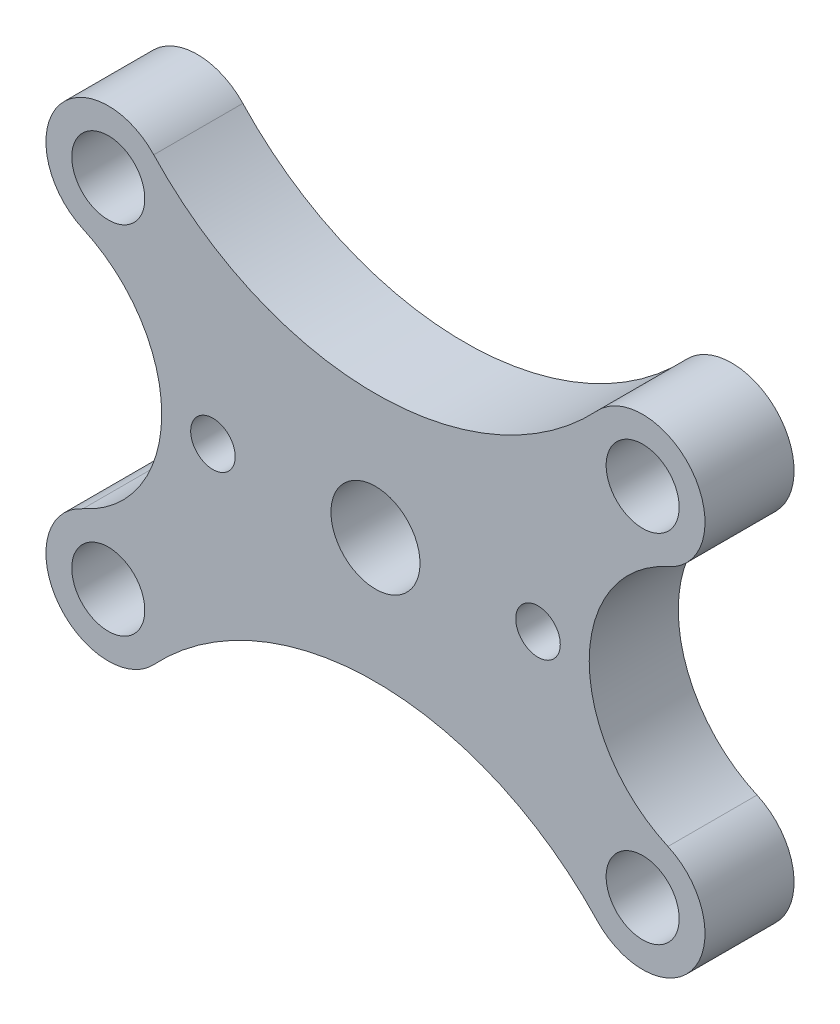
ISO-10303-21;
HEADER;
FILE_DESCRIPTION(('STEP AP214'),'2;1');
FILE_NAME('part.step','',(''),(''),'','','');
FILE_SCHEMA(('AUTOMOTIVE_DESIGN { 1 0 10303 214 1 1 1 1 }'));
ENDSEC;
DATA;
#1=APPLICATION_CONTEXT('core data for automotive mechanical design processes');
#2=APPLICATION_PROTOCOL_DEFINITION('international standard','automotive_design',2000,#1);
#3=PRODUCT_CONTEXT('',#1,'mechanical');
#4=PRODUCT('Part','Part','',(#3));
#5=PRODUCT_RELATED_PRODUCT_CATEGORY('part','',(#4));
#6=PRODUCT_DEFINITION_FORMATION('','',#4);
#7=PRODUCT_DEFINITION_CONTEXT('part definition',#1,'design');
#8=PRODUCT_DEFINITION('design','',#6,#7);
#9=PRODUCT_DEFINITION_SHAPE('','',#8);
#10=(LENGTH_UNIT() NAMED_UNIT(*) SI_UNIT(.MILLI.,.METRE.));
#11=(NAMED_UNIT(*) PLANE_ANGLE_UNIT() SI_UNIT($,.RADIAN.));
#12=(NAMED_UNIT(*) SI_UNIT($,.STERADIAN.) SOLID_ANGLE_UNIT());
#13=UNCERTAINTY_MEASURE_WITH_UNIT(LENGTH_MEASURE(1.E-05),#10,'distance_accuracy_value','');
#14=(GEOMETRIC_REPRESENTATION_CONTEXT(3) GLOBAL_UNCERTAINTY_ASSIGNED_CONTEXT((#13)) GLOBAL_UNIT_ASSIGNED_CONTEXT((#10,
#11,#12)) REPRESENTATION_CONTEXT('',''));
#15=CARTESIAN_POINT('',(0.,0.,0.));
#16=DIRECTION('',(0.,0.,1.));
#17=DIRECTION('',(1.,0.,0.));
#18=AXIS2_PLACEMENT_3D('',#15,#16,#17);
#19=CARTESIAN_POINT('',(0.,48.1153846153846,10.));
#20=DIRECTION('',(0.,0.,-1.));
#21=DIRECTION('',(-1.,0.,0.));
#22=AXIS2_PLACEMENT_3D('',#19,#20,#21);
#23=CYLINDRICAL_SURFACE('',#22,34.1153846153846);
#24=CARTESIAN_POINT('',(0.,48.1153846153846,0.));
#25=DIRECTION('',(0.,0.,-1.));
#26=DIRECTION('',(1.,0.,0.));
#27=AXIS2_PLACEMENT_3D('',#24,#25,#26);
#28=CIRCLE('',#27,34.1153846153846);
#29=CARTESIAN_POINT('',(24.8924228250702,24.7867165575304,0.));
#30=VERTEX_POINT('',#29);
#31=CARTESIAN_POINT('',(-24.8924228250702,24.7867165575304,0.));
#32=VERTEX_POINT('',#31);
#33=EDGE_CURVE('E86',#30,#32,#28,.T.);
#34=ORIENTED_EDGE('',*,*,#33,.T.);
#35=DIRECTION('',(0.,0.,-1.));
#36=VECTOR('',#35,1.);
#37=CARTESIAN_POINT('',(-24.8924228250702,24.7867165575304,10.));
#38=LINE('',#37,#36);
#39=CARTESIAN_POINT('',(-24.8924228250702,24.7867165575304,10.));
#40=VERTEX_POINT('',#39);
#41=EDGE_CURVE('E153',#40,#32,#38,.T.);
#42=ORIENTED_EDGE('',*,*,#41,.F.);
#43=CARTESIAN_POINT('',(0.,48.1153846153846,10.));
#44=DIRECTION('',(0.,0.,-1.));
#45=DIRECTION('',(1.,0.,0.));
#46=AXIS2_PLACEMENT_3D('',#43,#44,#45);
#47=CIRCLE('',#46,34.1153846153846);
#48=CARTESIAN_POINT('',(24.8924228250702,24.7867165575304,10.));
#49=VERTEX_POINT('',#48);
#50=EDGE_CURVE('E114',#49,#40,#47,.T.);
#51=ORIENTED_EDGE('',*,*,#50,.F.);
#52=DIRECTION('',(0.,0.,-1.));
#53=VECTOR('',#52,1.);
#54=CARTESIAN_POINT('',(24.8924228250702,24.7867165575304,10.));
#55=LINE('',#54,#53);
#56=EDGE_CURVE('E42',#49,#30,#55,.T.);
#57=ORIENTED_EDGE('',*,*,#56,.T.);
#58=EDGE_LOOP('',(#34,#42,#51,#57));
#59=FACE_BOUND('',#58,.T.);
#60=ADVANCED_FACE('F34',(#59),#23,.F.);
#61=CARTESIAN_POINT('',(38.8846153846154,0.,10.));
#62=DIRECTION('',(0.,0.,-1.));
#63=DIRECTION('',(-1.,0.,0.));
#64=AXIS2_PLACEMENT_3D('',#61,#62,#63);
#65=CYLINDRICAL_SURFACE('',#64,14.8846153846154);
#66=CARTESIAN_POINT('',(38.8846153846154,0.,0.));
#67=DIRECTION('',(0.,0.,-1.));
#68=DIRECTION('',(-1.,0.,0.));
#69=AXIS2_PLACEMENT_3D('',#66,#67,#68);
#70=CIRCLE('',#69,14.8846153846154);
#71=CARTESIAN_POINT('',(32.8418277680141,-13.6028119507909,0.));
#72=VERTEX_POINT('',#71);
#73=CARTESIAN_POINT('',(32.8418277680141,13.6028119507909,0.));
#74=VERTEX_POINT('',#73);
#75=EDGE_CURVE('E61',#72,#74,#70,.T.);
#76=ORIENTED_EDGE('',*,*,#75,.T.);
#77=DIRECTION('',(0.,0.,-1.));
#78=VECTOR('',#77,1.);
#79=CARTESIAN_POINT('',(32.8418277680141,13.6028119507909,10.));
#80=LINE('',#79,#78);
#81=CARTESIAN_POINT('',(32.8418277680141,13.6028119507909,10.));
#82=VERTEX_POINT('',#81);
#83=EDGE_CURVE('E11',#82,#74,#80,.T.);
#84=ORIENTED_EDGE('',*,*,#83,.F.);
#85=CARTESIAN_POINT('',(38.8846153846154,0.,10.));
#86=DIRECTION('',(0.,0.,-1.));
#87=DIRECTION('',(-1.,0.,0.));
#88=AXIS2_PLACEMENT_3D('',#85,#86,#87);
#89=CIRCLE('',#88,14.8846153846154);
#90=CARTESIAN_POINT('',(32.8418277680141,-13.6028119507909,10.));
#91=VERTEX_POINT('',#90);
#92=EDGE_CURVE('E66',#91,#82,#89,.T.);
#93=ORIENTED_EDGE('',*,*,#92,.F.);
#94=DIRECTION('',(0.,0.,-1.));
#95=VECTOR('',#94,1.);
#96=CARTESIAN_POINT('',(32.8418277680141,-13.6028119507909,10.));
#97=LINE('',#96,#95);
#98=EDGE_CURVE('E88',#91,#72,#97,.T.);
#99=ORIENTED_EDGE('',*,*,#98,.T.);
#100=EDGE_LOOP('',(#76,#84,#93,#99));
#101=FACE_BOUND('',#100,.T.);
#102=ADVANCED_FACE('F89',(#101),#65,.F.);
#103=CARTESIAN_POINT('',(30.,20.,10.));
#104=DIRECTION('',(0.,0.,-1.));
#105=DIRECTION('',(-1.,0.,0.));
#106=AXIS2_PLACEMENT_3D('',#103,#104,#105);
#107=CYLINDRICAL_SURFACE('',#106,7.);
#108=CARTESIAN_POINT('',(30.,20.,0.));
#109=DIRECTION('',(0.,0.,1.));
#110=DIRECTION('',(-1.,0.,0.));
#111=AXIS2_PLACEMENT_3D('',#108,#109,#110);
#112=CIRCLE('',#111,7.);
#113=EDGE_CURVE('E85',#74,#30,#112,.T.);
#114=ORIENTED_EDGE('',*,*,#113,.T.);
#115=ORIENTED_EDGE('',*,*,#56,.F.);
#116=CARTESIAN_POINT('',(30.,20.,10.));
#117=DIRECTION('',(0.,0.,1.));
#118=DIRECTION('',(-1.,0.,0.));
#119=AXIS2_PLACEMENT_3D('',#116,#117,#118);
#120=CIRCLE('',#119,7.);
#121=EDGE_CURVE('E50',#82,#49,#120,.T.);
#122=ORIENTED_EDGE('',*,*,#121,.F.);
#123=ORIENTED_EDGE('',*,*,#83,.T.);
#124=EDGE_LOOP('',(#114,#115,#122,#123));
#125=FACE_BOUND('',#124,.T.);
#126=ADVANCED_FACE('F229',(#125),#107,.T.);
#127=CARTESIAN_POINT('',(0.,48.1153846153846,10.));
#128=DIRECTION('',(0.,0.,1.));
#129=DIRECTION('',(1.,0.,0.));
#130=AXIS2_PLACEMENT_3D('',#127,#128,#129);
#131=PLANE('',#130);
#132=CARTESIAN_POINT('',(0.,0.,10.));
#133=DIRECTION('',(0.,0.,1.));
#134=DIRECTION('',(1.,0.,0.));
#135=AXIS2_PLACEMENT_3D('',#132,#133,#134);
#136=CIRCLE('',#135,5.);
#137=CARTESIAN_POINT('',(5.,0.,10.));
#138=VERTEX_POINT('',#137);
#139=EDGE_CURVE('E215',#138,#138,#136,.T.);
#140=ORIENTED_EDGE('',*,*,#139,.F.);
#141=EDGE_LOOP('',(#140));
#142=FACE_BOUND('',#141,.T.);
#143=CARTESIAN_POINT('',(-18.25,0.,10.));
#144=DIRECTION('',(0.,0.,-1.));
#145=DIRECTION('',(-1.,0.,0.));
#146=AXIS2_PLACEMENT_3D('',#143,#144,#145);
#147=CIRCLE('',#146,2.5);
#148=CARTESIAN_POINT('',(-20.75,0.,10.));
#149=VERTEX_POINT('',#148);
#150=EDGE_CURVE('E209',#149,#149,#147,.T.);
#151=ORIENTED_EDGE('',*,*,#150,.T.);
#152=EDGE_LOOP('',(#151));
#153=FACE_BOUND('',#152,.T.);
#154=CARTESIAN_POINT('',(-30.,-20.,10.));
#155=DIRECTION('',(0.,0.,1.));
#156=DIRECTION('',(-1.,0.,0.));
#157=AXIS2_PLACEMENT_3D('',#154,#155,#156);
#158=CIRCLE('',#157,4.1);
#159=CARTESIAN_POINT('',(-34.1,-20.,10.));
#160=VERTEX_POINT('',#159);
#161=EDGE_CURVE('E204',#160,#160,#158,.T.);
#162=ORIENTED_EDGE('',*,*,#161,.F.);
#163=EDGE_LOOP('',(#162));
#164=FACE_BOUND('',#163,.T.);
#165=CARTESIAN_POINT('',(-30.,-20.,10.));
#166=DIRECTION('',(0.,0.,1.));
#167=DIRECTION('',(1.,0.,0.));
#168=AXIS2_PLACEMENT_3D('',#165,#166,#167);
#169=CIRCLE('',#168,7.);
#170=CARTESIAN_POINT('',(-32.8418277680141,-13.6028119507909,10.));
#171=VERTEX_POINT('',#170);
#172=CARTESIAN_POINT('',(-24.8924228250702,-24.7867165575304,10.));
#173=VERTEX_POINT('',#172);
#174=EDGE_CURVE('E171',#171,#173,#169,.T.);
#175=ORIENTED_EDGE('',*,*,#174,.T.);
#176=CARTESIAN_POINT('',(0.,-48.1153846153846,10.));
#177=DIRECTION('',(0.,0.,1.));
#178=DIRECTION('',(1.,0.,0.));
#179=AXIS2_PLACEMENT_3D('',#176,#177,#178);
#180=CIRCLE('',#179,34.1153846153846);
#181=CARTESIAN_POINT('',(24.8924228250702,-24.7867165575304,10.));
#182=VERTEX_POINT('',#181);
#183=EDGE_CURVE('E98',#182,#173,#180,.T.);
#184=ORIENTED_EDGE('',*,*,#183,.F.);
#185=CARTESIAN_POINT('',(30.,-20.,10.));
#186=DIRECTION('',(0.,0.,-1.));
#187=DIRECTION('',(-1.,0.,0.));
#188=AXIS2_PLACEMENT_3D('',#185,#186,#187);
#189=CIRCLE('',#188,7.);
#190=EDGE_CURVE('E94',#91,#182,#189,.T.);
#191=ORIENTED_EDGE('',*,*,#190,.F.);
#192=ORIENTED_EDGE('',*,*,#92,.T.);
#193=ORIENTED_EDGE('',*,*,#121,.T.);
#194=ORIENTED_EDGE('',*,*,#50,.T.);
#195=CARTESIAN_POINT('',(-30.,20.,10.));
#196=DIRECTION('',(0.,0.,-1.));
#197=DIRECTION('',(1.,0.,0.));
#198=AXIS2_PLACEMENT_3D('',#195,#196,#197);
#199=CIRCLE('',#198,7.);
#200=CARTESIAN_POINT('',(-32.8418277680141,13.6028119507909,10.));
#201=VERTEX_POINT('',#200);
#202=EDGE_CURVE('E141',#201,#40,#199,.T.);
#203=ORIENTED_EDGE('',*,*,#202,.F.);
#204=CARTESIAN_POINT('',(-38.8846153846154,0.,10.));
#205=DIRECTION('',(0.,0.,1.));
#206=DIRECTION('',(1.,0.,0.));
#207=AXIS2_PLACEMENT_3D('',#204,#205,#206);
#208=CIRCLE('',#207,14.8846153846154);
#209=EDGE_CURVE('E147',#171,#201,#208,.T.);
#210=ORIENTED_EDGE('',*,*,#209,.F.);
#211=EDGE_LOOP('',(#175,#184,#191,#192,#193,#194,#203,#210));
#212=FACE_BOUND('',#211,.T.);
#213=CARTESIAN_POINT('',(-30.,20.,10.));
#214=DIRECTION('',(0.,0.,-1.));
#215=DIRECTION('',(-1.,0.,0.));
#216=AXIS2_PLACEMENT_3D('',#213,#214,#215);
#217=CIRCLE('',#216,4.1);
#218=CARTESIAN_POINT('',(-34.1,20.,10.));
#219=VERTEX_POINT('',#218);
#220=EDGE_CURVE('E139',#219,#219,#217,.T.);
#221=ORIENTED_EDGE('',*,*,#220,.T.);
#222=EDGE_LOOP('',(#221));
#223=FACE_BOUND('',#222,.T.);
#224=CARTESIAN_POINT('',(18.25,0.,10.));
#225=DIRECTION('',(0.,0.,1.));
#226=DIRECTION('',(1.,0.,0.));
#227=AXIS2_PLACEMENT_3D('',#224,#225,#226);
#228=CIRCLE('',#227,2.5);
#229=CARTESIAN_POINT('',(20.75,0.,10.));
#230=VERTEX_POINT('',#229);
#231=EDGE_CURVE('E156',#230,#230,#228,.T.);
#232=ORIENTED_EDGE('',*,*,#231,.F.);
#233=EDGE_LOOP('',(#232));
#234=FACE_BOUND('',#233,.T.);
#235=CARTESIAN_POINT('',(30.,-20.,10.));
#236=DIRECTION('',(0.,0.,-1.));
#237=DIRECTION('',(1.,0.,0.));
#238=AXIS2_PLACEMENT_3D('',#235,#236,#237);
#239=CIRCLE('',#238,4.1);
#240=CARTESIAN_POINT('',(34.1,-20.,10.));
#241=VERTEX_POINT('',#240);
#242=EDGE_CURVE('E103',#241,#241,#239,.T.);
#243=ORIENTED_EDGE('',*,*,#242,.T.);
#244=EDGE_LOOP('',(#243));
#245=FACE_BOUND('',#244,.T.);
#246=CARTESIAN_POINT('',(30.,20.,10.));
#247=DIRECTION('',(0.,0.,1.));
#248=DIRECTION('',(1.,0.,0.));
#249=AXIS2_PLACEMENT_3D('',#246,#247,#248);
#250=CIRCLE('',#249,4.1);
#251=CARTESIAN_POINT('',(34.1,20.,10.));
#252=VERTEX_POINT('',#251);
#253=EDGE_CURVE('E109',#252,#252,#250,.T.);
#254=ORIENTED_EDGE('',*,*,#253,.F.);
#255=EDGE_LOOP('',(#254));
#256=FACE_BOUND('',#255,.T.);
#257=ADVANCED_FACE('F167',(#142,#153,#164,#212,#223,#234,#245,#256),#131,.T.);
#258=CARTESIAN_POINT('',(0.,48.1153846153846,0.));
#259=DIRECTION('',(0.,0.,1.));
#260=DIRECTION('',(1.,0.,0.));
#261=AXIS2_PLACEMENT_3D('',#258,#259,#260);
#262=PLANE('',#261);
#263=CARTESIAN_POINT('',(0.,0.,0.));
#264=DIRECTION('',(0.,0.,1.));
#265=DIRECTION('',(1.,0.,0.));
#266=AXIS2_PLACEMENT_3D('',#263,#264,#265);
#267=CIRCLE('',#266,5.);
#268=CARTESIAN_POINT('',(5.,0.,0.));
#269=VERTEX_POINT('',#268);
#270=EDGE_CURVE('E218',#269,#269,#267,.T.);
#271=ORIENTED_EDGE('',*,*,#270,.T.);
#272=EDGE_LOOP('',(#271));
#273=FACE_BOUND('',#272,.T.);
#274=CARTESIAN_POINT('',(-18.25,0.,0.));
#275=DIRECTION('',(0.,0.,-1.));
#276=DIRECTION('',(-1.,0.,0.));
#277=AXIS2_PLACEMENT_3D('',#274,#275,#276);
#278=CIRCLE('',#277,2.5);
#279=CARTESIAN_POINT('',(-20.75,0.,0.));
#280=VERTEX_POINT('',#279);
#281=EDGE_CURVE('E212',#280,#280,#278,.T.);
#282=ORIENTED_EDGE('',*,*,#281,.F.);
#283=EDGE_LOOP('',(#282));
#284=FACE_BOUND('',#283,.T.);
#285=CARTESIAN_POINT('',(-30.,-20.,0.));
#286=DIRECTION('',(0.,0.,1.));
#287=DIRECTION('',(-1.,0.,0.));
#288=AXIS2_PLACEMENT_3D('',#285,#286,#287);
#289=CIRCLE('',#288,4.1);
#290=CARTESIAN_POINT('',(-34.1,-20.,0.));
#291=VERTEX_POINT('',#290);
#292=EDGE_CURVE('E206',#291,#291,#289,.T.);
#293=ORIENTED_EDGE('',*,*,#292,.T.);
#294=EDGE_LOOP('',(#293));
#295=FACE_BOUND('',#294,.T.);
#296=CARTESIAN_POINT('',(0.,-48.1153846153846,0.));
#297=DIRECTION('',(0.,0.,1.));
#298=DIRECTION('',(1.,0.,0.));
#299=AXIS2_PLACEMENT_3D('',#296,#297,#298);
#300=CIRCLE('',#299,34.1153846153846);
#301=CARTESIAN_POINT('',(24.8924228250702,-24.7867165575304,0.));
#302=VERTEX_POINT('',#301);
#303=CARTESIAN_POINT('',(-24.8924228250702,-24.7867165575304,0.));
#304=VERTEX_POINT('',#303);
#305=EDGE_CURVE('E99',#302,#304,#300,.T.);
#306=ORIENTED_EDGE('',*,*,#305,.T.);
#307=CARTESIAN_POINT('',(-30.,-20.,0.));
#308=DIRECTION('',(0.,0.,1.));
#309=DIRECTION('',(1.,0.,0.));
#310=AXIS2_PLACEMENT_3D('',#307,#308,#309);
#311=CIRCLE('',#310,7.);
#312=CARTESIAN_POINT('',(-32.8418277680141,-13.6028119507909,0.));
#313=VERTEX_POINT('',#312);
#314=EDGE_CURVE('E201',#313,#304,#311,.T.);
#315=ORIENTED_EDGE('',*,*,#314,.F.);
#316=CARTESIAN_POINT('',(-38.8846153846154,0.,0.));
#317=DIRECTION('',(0.,0.,1.));
#318=DIRECTION('',(1.,0.,0.));
#319=AXIS2_PLACEMENT_3D('',#316,#317,#318);
#320=CIRCLE('',#319,14.8846153846154);
#321=CARTESIAN_POINT('',(-32.8418277680141,13.6028119507909,0.));
#322=VERTEX_POINT('',#321);
#323=EDGE_CURVE('E134',#313,#322,#320,.T.);
#324=ORIENTED_EDGE('',*,*,#323,.T.);
#325=CARTESIAN_POINT('',(-30.,20.,0.));
#326=DIRECTION('',(0.,0.,-1.));
#327=DIRECTION('',(1.,0.,0.));
#328=AXIS2_PLACEMENT_3D('',#325,#326,#327);
#329=CIRCLE('',#328,7.);
#330=EDGE_CURVE('E130',#322,#32,#329,.T.);
#331=ORIENTED_EDGE('',*,*,#330,.T.);
#332=ORIENTED_EDGE('',*,*,#33,.F.);
#333=ORIENTED_EDGE('',*,*,#113,.F.);
#334=ORIENTED_EDGE('',*,*,#75,.F.);
#335=CARTESIAN_POINT('',(30.,-20.,0.));
#336=DIRECTION('',(0.,0.,-1.));
#337=DIRECTION('',(-1.,0.,0.));
#338=AXIS2_PLACEMENT_3D('',#335,#336,#337);
#339=CIRCLE('',#338,7.);
#340=EDGE_CURVE('E83',#72,#302,#339,.T.);
#341=ORIENTED_EDGE('',*,*,#340,.T.);
#342=EDGE_LOOP('',(#306,#315,#324,#331,#332,#333,#334,#341));
#343=FACE_BOUND('',#342,.T.);
#344=CARTESIAN_POINT('',(-30.,20.,0.));
#345=DIRECTION('',(0.,0.,-1.));
#346=DIRECTION('',(-1.,0.,0.));
#347=AXIS2_PLACEMENT_3D('',#344,#345,#346);
#348=CIRCLE('',#347,4.1);
#349=CARTESIAN_POINT('',(-34.1,20.,0.));
#350=VERTEX_POINT('',#349);
#351=EDGE_CURVE('E144',#350,#350,#348,.T.);
#352=ORIENTED_EDGE('',*,*,#351,.F.);
#353=EDGE_LOOP('',(#352));
#354=FACE_BOUND('',#353,.T.);
#355=CARTESIAN_POINT('',(18.25,0.,0.));
#356=DIRECTION('',(0.,0.,1.));
#357=DIRECTION('',(1.,0.,0.));
#358=AXIS2_PLACEMENT_3D('',#355,#356,#357);
#359=CIRCLE('',#358,2.5);
#360=CARTESIAN_POINT('',(20.75,0.,0.));
#361=VERTEX_POINT('',#360);
#362=EDGE_CURVE('E155',#361,#361,#359,.T.);
#363=ORIENTED_EDGE('',*,*,#362,.T.);
#364=EDGE_LOOP('',(#363));
#365=FACE_BOUND('',#364,.T.);
#366=CARTESIAN_POINT('',(30.,-20.,0.));
#367=DIRECTION('',(0.,0.,-1.));
#368=DIRECTION('',(1.,0.,0.));
#369=AXIS2_PLACEMENT_3D('',#366,#367,#368);
#370=CIRCLE('',#369,4.1);
#371=CARTESIAN_POINT('',(34.1,-20.,0.));
#372=VERTEX_POINT('',#371);
#373=EDGE_CURVE('E159',#372,#372,#370,.T.);
#374=ORIENTED_EDGE('',*,*,#373,.F.);
#375=EDGE_LOOP('',(#374));
#376=FACE_BOUND('',#375,.T.);
#377=CARTESIAN_POINT('',(30.,20.,0.));
#378=DIRECTION('',(0.,0.,1.));
#379=DIRECTION('',(1.,0.,0.));
#380=AXIS2_PLACEMENT_3D('',#377,#378,#379);
#381=CIRCLE('',#380,4.1);
#382=CARTESIAN_POINT('',(34.1,20.,0.));
#383=VERTEX_POINT('',#382);
#384=EDGE_CURVE('E108',#383,#383,#381,.T.);
#385=ORIENTED_EDGE('',*,*,#384,.T.);
#386=EDGE_LOOP('',(#385));
#387=FACE_BOUND('',#386,.T.);
#388=ADVANCED_FACE('F80',(#273,#284,#295,#343,#354,#365,#376,#387),#262,.F.);
#389=CARTESIAN_POINT('',(30.,20.,10.));
#390=DIRECTION('',(0.,0.,-1.));
#391=DIRECTION('',(-1.,0.,0.));
#392=AXIS2_PLACEMENT_3D('',#389,#390,#391);
#393=CYLINDRICAL_SURFACE('',#392,4.1);
#394=ORIENTED_EDGE('',*,*,#253,.T.);
#395=EDGE_LOOP('',(#394));
#396=FACE_BOUND('',#395,.T.);
#397=ORIENTED_EDGE('',*,*,#384,.F.);
#398=EDGE_LOOP('',(#397));
#399=FACE_BOUND('',#398,.T.);
#400=ADVANCED_FACE('F244',(#396,#399),#393,.F.);
#401=CARTESIAN_POINT('',(0.,-48.1153846153846,10.));
#402=DIRECTION('',(0.,0.,-1.));
#403=DIRECTION('',(-1.,0.,0.));
#404=AXIS2_PLACEMENT_3D('',#401,#402,#403);
#405=CYLINDRICAL_SURFACE('',#404,34.1153846153846);
#406=ORIENTED_EDGE('',*,*,#305,.F.);
#407=DIRECTION('',(0.,0.,-1.));
#408=VECTOR('',#407,1.);
#409=CARTESIAN_POINT('',(24.8924228250702,-24.7867165575304,10.));
#410=LINE('',#409,#408);
#411=EDGE_CURVE('E93',#182,#302,#410,.T.);
#412=ORIENTED_EDGE('',*,*,#411,.F.);
#413=ORIENTED_EDGE('',*,*,#183,.T.);
#414=DIRECTION('',(0.,0.,-1.));
#415=VECTOR('',#414,1.);
#416=CARTESIAN_POINT('',(-24.8924228250702,-24.7867165575304,10.));
#417=LINE('',#416,#415);
#418=EDGE_CURVE('E177',#173,#304,#417,.T.);
#419=ORIENTED_EDGE('',*,*,#418,.T.);
#420=EDGE_LOOP('',(#406,#412,#413,#419));
#421=FACE_BOUND('',#420,.T.);
#422=ADVANCED_FACE('F175',(#421),#405,.F.);
#423=CARTESIAN_POINT('',(30.,-20.,10.));
#424=DIRECTION('',(0.,0.,-1.));
#425=DIRECTION('',(-1.,0.,0.));
#426=AXIS2_PLACEMENT_3D('',#423,#424,#425);
#427=CYLINDRICAL_SURFACE('',#426,7.);
#428=ORIENTED_EDGE('',*,*,#340,.F.);
#429=ORIENTED_EDGE('',*,*,#98,.F.);
#430=ORIENTED_EDGE('',*,*,#190,.T.);
#431=ORIENTED_EDGE('',*,*,#411,.T.);
#432=EDGE_LOOP('',(#428,#429,#430,#431));
#433=FACE_BOUND('',#432,.T.);
#434=ADVANCED_FACE('F96',(#433),#427,.T.);
#435=CARTESIAN_POINT('',(30.,-20.,10.));
#436=DIRECTION('',(0.,0.,-1.));
#437=DIRECTION('',(-1.,0.,0.));
#438=AXIS2_PLACEMENT_3D('',#435,#436,#437);
#439=CYLINDRICAL_SURFACE('',#438,4.1);
#440=ORIENTED_EDGE('',*,*,#242,.F.);
#441=EDGE_LOOP('',(#440));
#442=FACE_BOUND('',#441,.T.);
#443=ORIENTED_EDGE('',*,*,#373,.T.);
#444=EDGE_LOOP('',(#443));
#445=FACE_BOUND('',#444,.T.);
#446=ADVANCED_FACE('F331',(#442,#445),#439,.F.);
#447=CARTESIAN_POINT('',(18.25,0.,10.));
#448=DIRECTION('',(0.,0.,-1.));
#449=DIRECTION('',(-1.,0.,0.));
#450=AXIS2_PLACEMENT_3D('',#447,#448,#449);
#451=CYLINDRICAL_SURFACE('',#450,2.5);
#452=ORIENTED_EDGE('',*,*,#231,.T.);
#453=EDGE_LOOP('',(#452));
#454=FACE_BOUND('',#453,.T.);
#455=ORIENTED_EDGE('',*,*,#362,.F.);
#456=EDGE_LOOP('',(#455));
#457=FACE_BOUND('',#456,.T.);
#458=ADVANCED_FACE('F323',(#454,#457),#451,.F.);
#459=CARTESIAN_POINT('',(-30.,20.,10.));
#460=DIRECTION('',(0.,0.,-1.));
#461=DIRECTION('',(-1.,0.,0.));
#462=AXIS2_PLACEMENT_3D('',#459,#460,#461);
#463=CYLINDRICAL_SURFACE('',#462,7.);
#464=ORIENTED_EDGE('',*,*,#330,.F.);
#465=DIRECTION('',(0.,0.,-1.));
#466=VECTOR('',#465,1.);
#467=CARTESIAN_POINT('',(-32.8418277680141,13.6028119507909,10.));
#468=LINE('',#467,#466);
#469=EDGE_CURVE('E150',#201,#322,#468,.T.);
#470=ORIENTED_EDGE('',*,*,#469,.F.);
#471=ORIENTED_EDGE('',*,*,#202,.T.);
#472=ORIENTED_EDGE('',*,*,#41,.T.);
#473=EDGE_LOOP('',(#464,#470,#471,#472));
#474=FACE_BOUND('',#473,.T.);
#475=ADVANCED_FACE('F194',(#474),#463,.T.);
#476=CARTESIAN_POINT('',(-38.8846153846154,0.,10.));
#477=DIRECTION('',(0.,0.,-1.));
#478=DIRECTION('',(-1.,0.,0.));
#479=AXIS2_PLACEMENT_3D('',#476,#477,#478);
#480=CYLINDRICAL_SURFACE('',#479,14.8846153846154);
#481=ORIENTED_EDGE('',*,*,#323,.F.);
#482=DIRECTION('',(0.,0.,-1.));
#483=VECTOR('',#482,1.);
#484=CARTESIAN_POINT('',(-32.8418277680141,-13.6028119507909,10.));
#485=LINE('',#484,#483);
#486=EDGE_CURVE('E197',#171,#313,#485,.T.);
#487=ORIENTED_EDGE('',*,*,#486,.F.);
#488=ORIENTED_EDGE('',*,*,#209,.T.);
#489=ORIENTED_EDGE('',*,*,#469,.T.);
#490=EDGE_LOOP('',(#481,#487,#488,#489));
#491=FACE_BOUND('',#490,.T.);
#492=ADVANCED_FACE('F189',(#491),#480,.F.);
#493=CARTESIAN_POINT('',(-30.,20.,10.));
#494=DIRECTION('',(0.,0.,-1.));
#495=DIRECTION('',(-1.,0.,0.));
#496=AXIS2_PLACEMENT_3D('',#493,#494,#495);
#497=CYLINDRICAL_SURFACE('',#496,4.1);
#498=ORIENTED_EDGE('',*,*,#220,.F.);
#499=EDGE_LOOP('',(#498));
#500=FACE_BOUND('',#499,.T.);
#501=ORIENTED_EDGE('',*,*,#351,.T.);
#502=EDGE_LOOP('',(#501));
#503=FACE_BOUND('',#502,.T.);
#504=ADVANCED_FACE('F303',(#500,#503),#497,.F.);
#505=CARTESIAN_POINT('',(-30.,-20.,10.));
#506=DIRECTION('',(0.,0.,-1.));
#507=DIRECTION('',(-1.,0.,0.));
#508=AXIS2_PLACEMENT_3D('',#505,#506,#507);
#509=CYLINDRICAL_SURFACE('',#508,7.);
#510=ORIENTED_EDGE('',*,*,#314,.T.);
#511=ORIENTED_EDGE('',*,*,#418,.F.);
#512=ORIENTED_EDGE('',*,*,#174,.F.);
#513=ORIENTED_EDGE('',*,*,#486,.T.);
#514=EDGE_LOOP('',(#510,#511,#512,#513));
#515=FACE_BOUND('',#514,.T.);
#516=ADVANCED_FACE('F239',(#515),#509,.T.);
#517=CARTESIAN_POINT('',(-30.,-20.,10.));
#518=DIRECTION('',(0.,0.,-1.));
#519=DIRECTION('',(-1.,0.,0.));
#520=AXIS2_PLACEMENT_3D('',#517,#518,#519);
#521=CYLINDRICAL_SURFACE('',#520,4.1);
#522=ORIENTED_EDGE('',*,*,#161,.T.);
#523=EDGE_LOOP('',(#522));
#524=FACE_BOUND('',#523,.T.);
#525=ORIENTED_EDGE('',*,*,#292,.F.);
#526=EDGE_LOOP('',(#525));
#527=FACE_BOUND('',#526,.T.);
#528=ADVANCED_FACE('F235',(#524,#527),#521,.F.);
#529=CARTESIAN_POINT('',(-18.25,0.,10.));
#530=DIRECTION('',(0.,0.,-1.));
#531=DIRECTION('',(-1.,0.,0.));
#532=AXIS2_PLACEMENT_3D('',#529,#530,#531);
#533=CYLINDRICAL_SURFACE('',#532,2.5);
#534=ORIENTED_EDGE('',*,*,#150,.F.);
#535=EDGE_LOOP('',(#534));
#536=FACE_BOUND('',#535,.T.);
#537=ORIENTED_EDGE('',*,*,#281,.T.);
#538=EDGE_LOOP('',(#537));
#539=FACE_BOUND('',#538,.T.);
#540=ADVANCED_FACE('F238',(#536,#539),#533,.F.);
#541=CARTESIAN_POINT('',(0.,0.,10.));
#542=DIRECTION('',(0.,0.,-1.));
#543=DIRECTION('',(-1.,0.,0.));
#544=AXIS2_PLACEMENT_3D('',#541,#542,#543);
#545=CYLINDRICAL_SURFACE('',#544,5.);
#546=ORIENTED_EDGE('',*,*,#139,.T.);
#547=EDGE_LOOP('',(#546));
#548=FACE_BOUND('',#547,.T.);
#549=ORIENTED_EDGE('',*,*,#270,.F.);
#550=EDGE_LOOP('',(#549));
#551=FACE_BOUND('',#550,.T.);
#552=ADVANCED_FACE('F224',(#548,#551),#545,.F.);
#553=CLOSED_SHELL('',(#60,#102,#126,#257,#388,#400,#422,#434,#446,#458,#475,#492,#504,#516,#528,
#540,#552));
#554=MANIFOLD_SOLID_BREP('B2',#553);
#555=ADVANCED_BREP_SHAPE_REPRESENTATION('',(#18,#554),#14);
#556=SHAPE_DEFINITION_REPRESENTATION(#9,#555);
ENDSEC;
END-ISO-10303-21;
